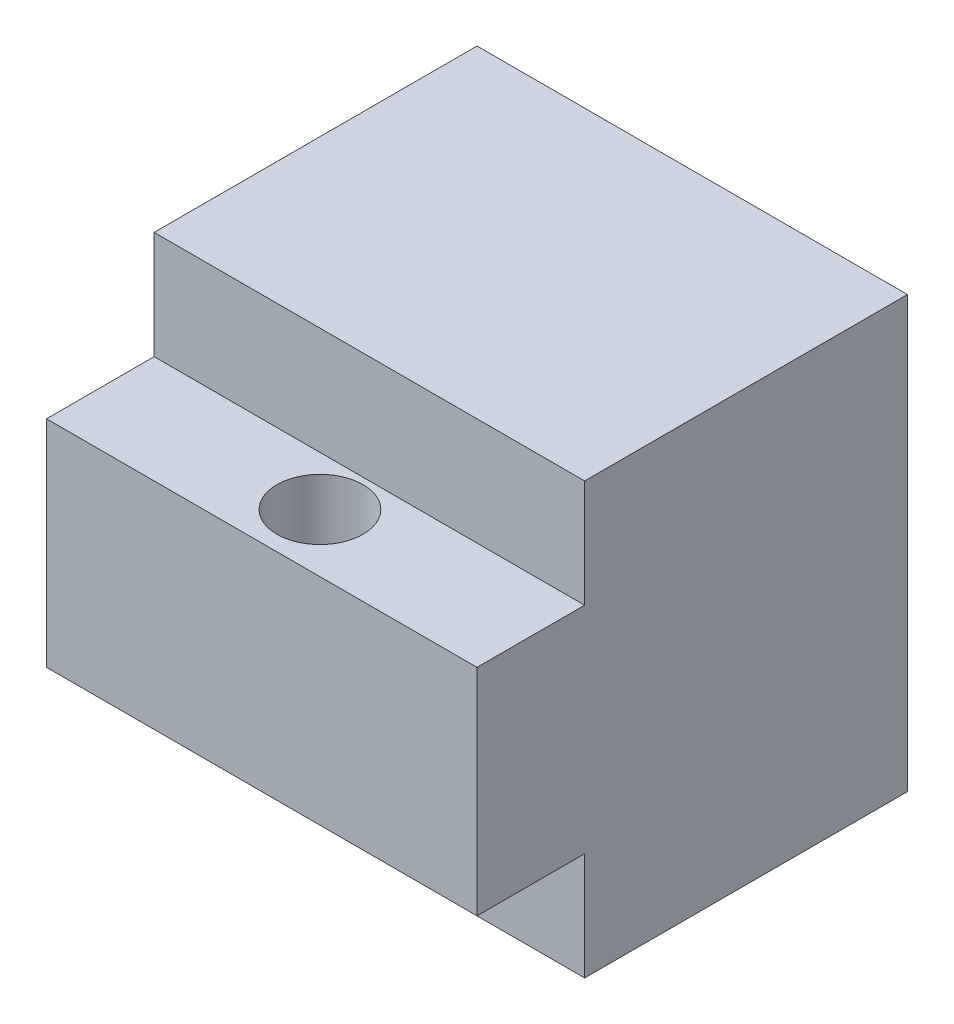
ISO-10303-21;
HEADER;
FILE_DESCRIPTION(('STEP AP214'),'2;1');
FILE_NAME('part.step','',(''),(''),'','','');
FILE_SCHEMA(('AUTOMOTIVE_DESIGN { 1 0 10303 214 1 1 1 1 }'));
ENDSEC;
DATA;
#1=APPLICATION_CONTEXT('core data for automotive mechanical design processes');
#2=APPLICATION_PROTOCOL_DEFINITION('international standard','automotive_design',2000,#1);
#3=PRODUCT_CONTEXT('',#1,'mechanical');
#4=PRODUCT('Part','Part','',(#3));
#5=PRODUCT_RELATED_PRODUCT_CATEGORY('part','',(#4));
#6=PRODUCT_DEFINITION_FORMATION('','',#4);
#7=PRODUCT_DEFINITION_CONTEXT('part definition',#1,'design');
#8=PRODUCT_DEFINITION('design','',#6,#7);
#9=PRODUCT_DEFINITION_SHAPE('','',#8);
#10=(LENGTH_UNIT() NAMED_UNIT(*) SI_UNIT(.MILLI.,.METRE.));
#11=(NAMED_UNIT(*) PLANE_ANGLE_UNIT() SI_UNIT($,.RADIAN.));
#12=(NAMED_UNIT(*) SI_UNIT($,.STERADIAN.) SOLID_ANGLE_UNIT());
#13=UNCERTAINTY_MEASURE_WITH_UNIT(LENGTH_MEASURE(1.E-05),#10,'distance_accuracy_value','');
#14=(GEOMETRIC_REPRESENTATION_CONTEXT(3) GLOBAL_UNCERTAINTY_ASSIGNED_CONTEXT((#13)) GLOBAL_UNIT_ASSIGNED_CONTEXT((#10,
#11,#12)) REPRESENTATION_CONTEXT('',''));
#15=CARTESIAN_POINT('',(0.,0.,0.));
#16=DIRECTION('',(0.,0.,1.));
#17=DIRECTION('',(1.,0.,0.));
#18=AXIS2_PLACEMENT_3D('',#15,#16,#17);
#19=CARTESIAN_POINT('',(10.,5.,2.5));
#20=DIRECTION('',(0.,0.,-1.));
#21=DIRECTION('',(-1.,0.,0.));
#22=AXIS2_PLACEMENT_3D('',#19,#20,#21);
#23=PLANE('',#22);
#24=DIRECTION('',(0.,-1.,0.));
#25=VECTOR('',#24,1.);
#26=CARTESIAN_POINT('',(0.,5.,2.5));
#27=LINE('',#26,#25);
#28=CARTESIAN_POINT('',(0.,5.,2.5));
#29=VERTEX_POINT('',#28);
#30=CARTESIAN_POINT('',(0.,2.5,2.5));
#31=VERTEX_POINT('',#30);
#32=EDGE_CURVE('E129',#29,#31,#27,.T.);
#33=ORIENTED_EDGE('',*,*,#32,.T.);
#34=DIRECTION('',(-1.,0.,0.));
#35=VECTOR('',#34,1.);
#36=CARTESIAN_POINT('',(10.,2.5,2.5));
#37=LINE('',#36,#35);
#38=CARTESIAN_POINT('',(10.,2.5,2.5));
#39=VERTEX_POINT('',#38);
#40=EDGE_CURVE('E11',#39,#31,#37,.T.);
#41=ORIENTED_EDGE('',*,*,#40,.F.);
#42=DIRECTION('',(0.,-1.,0.));
#43=VECTOR('',#42,1.);
#44=CARTESIAN_POINT('',(10.,5.,2.5));
#45=LINE('',#44,#43);
#46=CARTESIAN_POINT('',(10.,5.,2.5));
#47=VERTEX_POINT('',#46);
#48=EDGE_CURVE('E143',#47,#39,#45,.T.);
#49=ORIENTED_EDGE('',*,*,#48,.F.);
#50=DIRECTION('',(-1.,0.,0.));
#51=VECTOR('',#50,1.);
#52=CARTESIAN_POINT('',(10.,5.,2.5));
#53=LINE('',#52,#51);
#54=EDGE_CURVE('E125',#47,#29,#53,.T.);
#55=ORIENTED_EDGE('',*,*,#54,.T.);
#56=EDGE_LOOP('',(#33,#41,#49,#55));
#57=FACE_BOUND('',#56,.T.);
#58=ADVANCED_FACE('F32',(#57),#23,.F.);
#59=CARTESIAN_POINT('',(10.,2.5,5.));
#60=DIRECTION('',(0.,-1.,0.));
#61=DIRECTION('',(0.,0.,-1.));
#62=AXIS2_PLACEMENT_3D('',#59,#60,#61);
#63=PLANE('',#62);
#64=CARTESIAN_POINT('',(5.,2.5,3.64787964638669));
#65=DIRECTION('',(0.,1.,0.));
#66=DIRECTION('',(0.,0.,1.));
#67=AXIS2_PLACEMENT_3D('',#64,#65,#66);
#68=CIRCLE('',#67,1.);
#69=CARTESIAN_POINT('',(5.,2.5,4.64787964638669));
#70=VERTEX_POINT('',#69);
#71=EDGE_CURVE('E177',#70,#70,#68,.T.);
#72=ORIENTED_EDGE('',*,*,#71,.F.);
#73=EDGE_LOOP('',(#72));
#74=FACE_BOUND('',#73,.T.);
#75=DIRECTION('',(0.,0.,1.));
#76=VECTOR('',#75,1.);
#77=CARTESIAN_POINT('',(0.,2.5,5.));
#78=LINE('',#77,#76);
#79=CARTESIAN_POINT('',(0.,2.5,5.));
#80=VERTEX_POINT('',#79);
#81=EDGE_CURVE('E132',#31,#80,#78,.T.);
#82=ORIENTED_EDGE('',*,*,#81,.T.);
#83=DIRECTION('',(-1.,0.,0.));
#84=VECTOR('',#83,1.);
#85=CARTESIAN_POINT('',(10.,2.5,5.));
#86=LINE('',#85,#84);
#87=CARTESIAN_POINT('',(10.,2.5,5.));
#88=VERTEX_POINT('',#87);
#89=EDGE_CURVE('E41',#88,#80,#86,.T.);
#90=ORIENTED_EDGE('',*,*,#89,.F.);
#91=DIRECTION('',(0.,0.,1.));
#92=VECTOR('',#91,1.);
#93=CARTESIAN_POINT('',(10.,2.5,5.));
#94=LINE('',#93,#92);
#95=EDGE_CURVE('E92',#39,#88,#94,.T.);
#96=ORIENTED_EDGE('',*,*,#95,.F.);
#97=ORIENTED_EDGE('',*,*,#40,.T.);
#98=EDGE_LOOP('',(#82,#90,#96,#97));
#99=FACE_BOUND('',#98,.T.);
#100=ADVANCED_FACE('F194',(#74,#99),#63,.F.);
#101=CARTESIAN_POINT('',(10.,2.5,5.));
#102=DIRECTION('',(0.,0.,-1.));
#103=DIRECTION('',(-1.,0.,0.));
#104=AXIS2_PLACEMENT_3D('',#101,#102,#103);
#105=PLANE('',#104);
#106=DIRECTION('',(0.,-1.,0.));
#107=VECTOR('',#106,1.);
#108=CARTESIAN_POINT('',(0.,2.5,5.));
#109=LINE('',#108,#107);
#110=CARTESIAN_POINT('',(0.,-2.5,5.));
#111=VERTEX_POINT('',#110);
#112=EDGE_CURVE('E134',#80,#111,#109,.T.);
#113=ORIENTED_EDGE('',*,*,#112,.T.);
#114=DIRECTION('',(-1.,0.,0.));
#115=VECTOR('',#114,1.);
#116=CARTESIAN_POINT('',(10.,-2.5,5.));
#117=LINE('',#116,#115);
#118=CARTESIAN_POINT('',(10.,-2.5,5.));
#119=VERTEX_POINT('',#118);
#120=EDGE_CURVE('E150',#119,#111,#117,.T.);
#121=ORIENTED_EDGE('',*,*,#120,.F.);
#122=DIRECTION('',(0.,-1.,0.));
#123=VECTOR('',#122,1.);
#124=CARTESIAN_POINT('',(10.,2.5,5.));
#125=LINE('',#124,#123);
#126=EDGE_CURVE('E159',#88,#119,#125,.T.);
#127=ORIENTED_EDGE('',*,*,#126,.F.);
#128=ORIENTED_EDGE('',*,*,#89,.T.);
#129=EDGE_LOOP('',(#113,#121,#127,#128));
#130=FACE_BOUND('',#129,.T.);
#131=ADVANCED_FACE('F157',(#130),#105,.F.);
#132=CARTESIAN_POINT('',(10.,-2.5,5.));
#133=DIRECTION('',(0.,1.,0.));
#134=DIRECTION('',(0.,0.,1.));
#135=AXIS2_PLACEMENT_3D('',#132,#133,#134);
#136=PLANE('',#135);
#137=CARTESIAN_POINT('',(5.,-2.5,3.64787964638668));
#138=DIRECTION('',(0.,1.,0.));
#139=DIRECTION('',(0.,0.,1.));
#140=AXIS2_PLACEMENT_3D('',#137,#138,#139);
#141=CIRCLE('',#140,1.);
#142=CARTESIAN_POINT('',(5.,-2.5,4.64787964638668));
#143=VERTEX_POINT('',#142);
#144=EDGE_CURVE('E35',#143,#143,#141,.T.);
#145=ORIENTED_EDGE('',*,*,#144,.T.);
#146=EDGE_LOOP('',(#145));
#147=FACE_BOUND('',#146,.T.);
#148=DIRECTION('',(0.,0.,-1.));
#149=VECTOR('',#148,1.);
#150=CARTESIAN_POINT('',(0.,-2.5,5.));
#151=LINE('',#150,#149);
#152=CARTESIAN_POINT('',(0.,-2.5,2.5));
#153=VERTEX_POINT('',#152);
#154=EDGE_CURVE('E136',#111,#153,#151,.T.);
#155=ORIENTED_EDGE('',*,*,#154,.T.);
#156=DIRECTION('',(-1.,0.,0.));
#157=VECTOR('',#156,1.);
#158=CARTESIAN_POINT('',(10.,-2.5,2.5));
#159=LINE('',#158,#157);
#160=CARTESIAN_POINT('',(10.,-2.5,2.5));
#161=VERTEX_POINT('',#160);
#162=EDGE_CURVE('E147',#161,#153,#159,.T.);
#163=ORIENTED_EDGE('',*,*,#162,.F.);
#164=DIRECTION('',(0.,0.,-1.));
#165=VECTOR('',#164,1.);
#166=CARTESIAN_POINT('',(10.,-2.5,5.));
#167=LINE('',#166,#165);
#168=EDGE_CURVE('E171',#119,#161,#167,.T.);
#169=ORIENTED_EDGE('',*,*,#168,.F.);
#170=ORIENTED_EDGE('',*,*,#120,.T.);
#171=EDGE_LOOP('',(#155,#163,#169,#170));
#172=FACE_BOUND('',#171,.T.);
#173=ADVANCED_FACE('F167',(#147,#172),#136,.F.);
#174=CARTESIAN_POINT('',(10.,-2.5,2.5));
#175=DIRECTION('',(0.,0.,-1.));
#176=DIRECTION('',(0.,1.,0.));
#177=AXIS2_PLACEMENT_3D('',#174,#175,#176);
#178=PLANE('',#177);
#179=DIRECTION('',(0.,-1.,0.));
#180=VECTOR('',#179,1.);
#181=CARTESIAN_POINT('',(0.,-2.5,2.5));
#182=LINE('',#181,#180);
#183=CARTESIAN_POINT('',(0.,-5.,2.5));
#184=VERTEX_POINT('',#183);
#185=EDGE_CURVE('E138',#153,#184,#182,.T.);
#186=ORIENTED_EDGE('',*,*,#185,.T.);
#187=DIRECTION('',(-1.,0.,0.));
#188=VECTOR('',#187,1.);
#189=CARTESIAN_POINT('',(10.,-5.,2.5));
#190=LINE('',#189,#188);
#191=CARTESIAN_POINT('',(10.,-5.,2.5));
#192=VERTEX_POINT('',#191);
#193=EDGE_CURVE('E120',#192,#184,#190,.T.);
#194=ORIENTED_EDGE('',*,*,#193,.F.);
#195=DIRECTION('',(0.,-1.,0.));
#196=VECTOR('',#195,1.);
#197=CARTESIAN_POINT('',(10.,-2.5,2.5));
#198=LINE('',#197,#196);
#199=EDGE_CURVE('E111',#161,#192,#198,.T.);
#200=ORIENTED_EDGE('',*,*,#199,.F.);
#201=ORIENTED_EDGE('',*,*,#162,.T.);
#202=EDGE_LOOP('',(#186,#194,#200,#201));
#203=FACE_BOUND('',#202,.T.);
#204=ADVANCED_FACE('F170',(#203),#178,.F.);
#205=CARTESIAN_POINT('',(10.,-5.,2.5));
#206=DIRECTION('',(0.,1.,0.));
#207=DIRECTION('',(0.,0.,1.));
#208=AXIS2_PLACEMENT_3D('',#205,#206,#207);
#209=PLANE('',#208);
#210=DIRECTION('',(0.,0.,-1.));
#211=VECTOR('',#210,1.);
#212=CARTESIAN_POINT('',(0.,-5.,2.5));
#213=LINE('',#212,#211);
#214=CARTESIAN_POINT('',(0.,-5.,-5.));
#215=VERTEX_POINT('',#214);
#216=EDGE_CURVE('E119',#184,#215,#213,.T.);
#217=ORIENTED_EDGE('',*,*,#216,.T.);
#218=DIRECTION('',(-1.,0.,0.));
#219=VECTOR('',#218,1.);
#220=CARTESIAN_POINT('',(10.,-5.,-5.));
#221=LINE('',#220,#219);
#222=CARTESIAN_POINT('',(10.,-5.,-5.));
#223=VERTEX_POINT('',#222);
#224=EDGE_CURVE('E116',#223,#215,#221,.T.);
#225=ORIENTED_EDGE('',*,*,#224,.F.);
#226=DIRECTION('',(0.,0.,-1.));
#227=VECTOR('',#226,1.);
#228=CARTESIAN_POINT('',(10.,-5.,2.5));
#229=LINE('',#228,#227);
#230=EDGE_CURVE('E105',#192,#223,#229,.T.);
#231=ORIENTED_EDGE('',*,*,#230,.F.);
#232=ORIENTED_EDGE('',*,*,#193,.T.);
#233=EDGE_LOOP('',(#217,#225,#231,#232));
#234=FACE_BOUND('',#233,.T.);
#235=ADVANCED_FACE('F117',(#234),#209,.F.);
#236=CARTESIAN_POINT('',(10.,5.,-5.));
#237=DIRECTION('',(0.,0.,1.));
#238=DIRECTION('',(1.,0.,0.));
#239=AXIS2_PLACEMENT_3D('',#236,#237,#238);
#240=PLANE('',#239);
#241=DIRECTION('',(0.,1.,0.));
#242=VECTOR('',#241,1.);
#243=CARTESIAN_POINT('',(0.,5.,-5.));
#244=LINE('',#243,#242);
#245=CARTESIAN_POINT('',(0.,5.,-5.));
#246=VERTEX_POINT('',#245);
#247=EDGE_CURVE('E78',#215,#246,#244,.T.);
#248=ORIENTED_EDGE('',*,*,#247,.T.);
#249=DIRECTION('',(-1.,0.,0.));
#250=VECTOR('',#249,1.);
#251=CARTESIAN_POINT('',(10.,5.,-5.));
#252=LINE('',#251,#250);
#253=CARTESIAN_POINT('',(10.,5.,-5.));
#254=VERTEX_POINT('',#253);
#255=EDGE_CURVE('E121',#254,#246,#252,.T.);
#256=ORIENTED_EDGE('',*,*,#255,.F.);
#257=DIRECTION('',(0.,1.,0.));
#258=VECTOR('',#257,1.);
#259=CARTESIAN_POINT('',(10.,5.,-5.));
#260=LINE('',#259,#258);
#261=EDGE_CURVE('E109',#223,#254,#260,.T.);
#262=ORIENTED_EDGE('',*,*,#261,.F.);
#263=ORIENTED_EDGE('',*,*,#224,.T.);
#264=EDGE_LOOP('',(#248,#256,#262,#263));
#265=FACE_BOUND('',#264,.T.);
#266=ADVANCED_FACE('F123',(#265),#240,.F.);
#267=CARTESIAN_POINT('',(10.,5.,2.5));
#268=DIRECTION('',(0.,-1.,0.));
#269=DIRECTION('',(0.,0.,-1.));
#270=AXIS2_PLACEMENT_3D('',#267,#268,#269);
#271=PLANE('',#270);
#272=DIRECTION('',(0.,0.,1.));
#273=VECTOR('',#272,1.);
#274=CARTESIAN_POINT('',(0.,5.,2.5));
#275=LINE('',#274,#273);
#276=EDGE_CURVE('E84',#246,#29,#275,.T.);
#277=ORIENTED_EDGE('',*,*,#276,.T.);
#278=ORIENTED_EDGE('',*,*,#54,.F.);
#279=DIRECTION('',(0.,0.,1.));
#280=VECTOR('',#279,1.);
#281=CARTESIAN_POINT('',(10.,5.,2.5));
#282=LINE('',#281,#280);
#283=EDGE_CURVE('E49',#254,#47,#282,.T.);
#284=ORIENTED_EDGE('',*,*,#283,.F.);
#285=ORIENTED_EDGE('',*,*,#255,.T.);
#286=EDGE_LOOP('',(#277,#278,#284,#285));
#287=FACE_BOUND('',#286,.T.);
#288=ADVANCED_FACE('F202',(#287),#271,.F.);
#289=CARTESIAN_POINT('',(10.,0.,0.));
#290=DIRECTION('',(1.,0.,0.));
#291=DIRECTION('',(0.,0.,-1.));
#292=AXIS2_PLACEMENT_3D('',#289,#290,#291);
#293=PLANE('',#292);
#294=ORIENTED_EDGE('',*,*,#48,.T.);
#295=ORIENTED_EDGE('',*,*,#95,.T.);
#296=ORIENTED_EDGE('',*,*,#126,.T.);
#297=ORIENTED_EDGE('',*,*,#168,.T.);
#298=ORIENTED_EDGE('',*,*,#199,.T.);
#299=ORIENTED_EDGE('',*,*,#230,.T.);
#300=ORIENTED_EDGE('',*,*,#261,.T.);
#301=ORIENTED_EDGE('',*,*,#283,.T.);
#302=EDGE_LOOP('',(#294,#295,#296,#297,#298,#299,#300,#301));
#303=FACE_BOUND('',#302,.T.);
#304=ADVANCED_FACE('F107',(#303),#293,.T.);
#305=CARTESIAN_POINT('',(0.,0.,0.));
#306=DIRECTION('',(1.,0.,0.));
#307=DIRECTION('',(0.,0.,-1.));
#308=AXIS2_PLACEMENT_3D('',#305,#306,#307);
#309=PLANE('',#308);
#310=ORIENTED_EDGE('',*,*,#32,.F.);
#311=ORIENTED_EDGE('',*,*,#276,.F.);
#312=ORIENTED_EDGE('',*,*,#247,.F.);
#313=ORIENTED_EDGE('',*,*,#216,.F.);
#314=ORIENTED_EDGE('',*,*,#185,.F.);
#315=ORIENTED_EDGE('',*,*,#154,.F.);
#316=ORIENTED_EDGE('',*,*,#112,.F.);
#317=ORIENTED_EDGE('',*,*,#81,.F.);
#318=EDGE_LOOP('',(#310,#311,#312,#313,#314,#315,#316,#317));
#319=FACE_BOUND('',#318,.T.);
#320=ADVANCED_FACE('F163',(#319),#309,.F.);
#321=CARTESIAN_POINT('',(5.,-5.,3.64787964638668));
#322=DIRECTION('',(0.,1.,0.));
#323=DIRECTION('',(0.,0.,1.));
#324=AXIS2_PLACEMENT_3D('',#321,#322,#323);
#325=CYLINDRICAL_SURFACE('',#324,1.);
#326=ORIENTED_EDGE('',*,*,#71,.T.);
#327=EDGE_LOOP('',(#326));
#328=FACE_BOUND('',#327,.T.);
#329=ORIENTED_EDGE('',*,*,#144,.F.);
#330=EDGE_LOOP('',(#329));
#331=FACE_BOUND('',#330,.T.);
#332=ADVANCED_FACE('F185',(#328,#331),#325,.F.);
#333=CLOSED_SHELL('',(#58,#100,#131,#173,#204,#235,#266,#288,#304,#320,#332));
#334=MANIFOLD_SOLID_BREP('B2',#333);
#335=ADVANCED_BREP_SHAPE_REPRESENTATION('',(#18,#334),#14);
#336=SHAPE_DEFINITION_REPRESENTATION(#9,#335);
ENDSEC;
END-ISO-10303-21;
